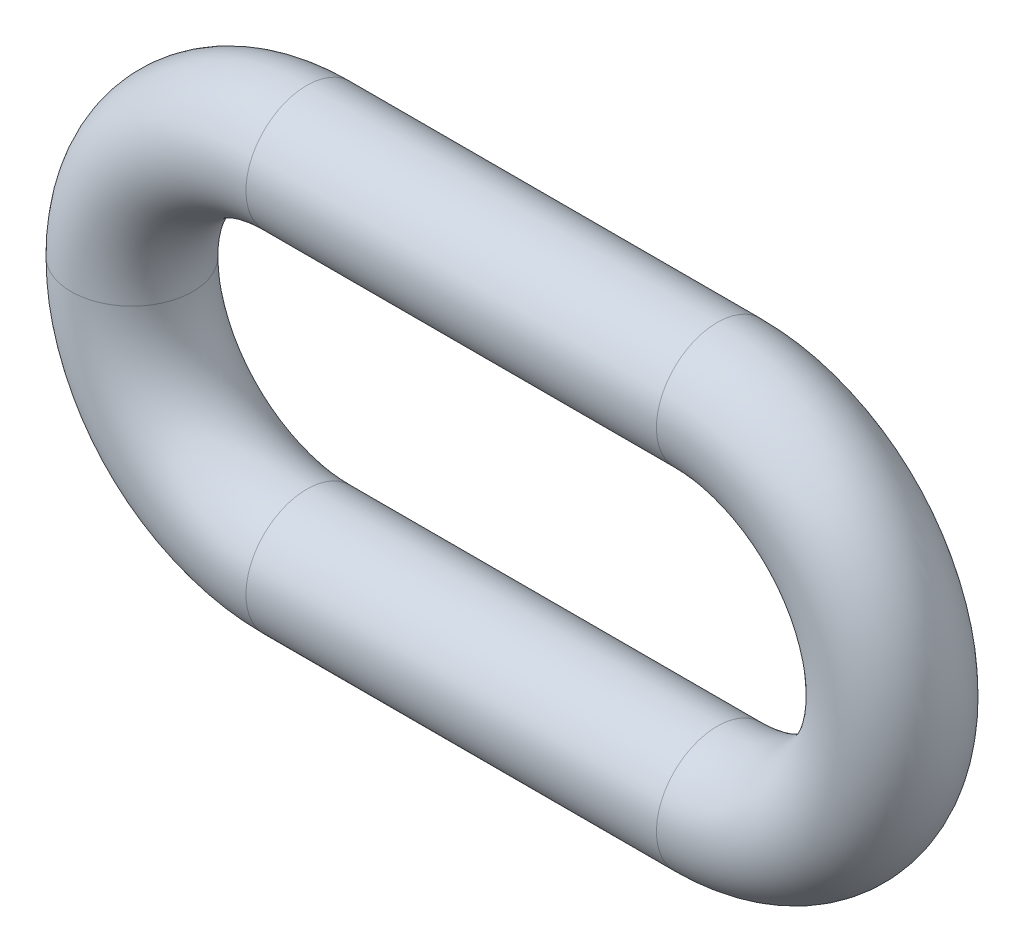
ISO-10303-21;
HEADER;
FILE_DESCRIPTION(('STEP AP214'),'2;1');
FILE_NAME('part.step','',(''),(''),'','','');
FILE_SCHEMA(('AUTOMOTIVE_DESIGN { 1 0 10303 214 1 1 1 1 }'));
ENDSEC;
DATA;
#1=APPLICATION_CONTEXT('core data for automotive mechanical design processes');
#2=APPLICATION_PROTOCOL_DEFINITION('international standard','automotive_design',2000,#1);
#3=PRODUCT_CONTEXT('',#1,'mechanical');
#4=PRODUCT('Part','Part','',(#3));
#5=PRODUCT_RELATED_PRODUCT_CATEGORY('part','',(#4));
#6=PRODUCT_DEFINITION_FORMATION('','',#4);
#7=PRODUCT_DEFINITION_CONTEXT('part definition',#1,'design');
#8=PRODUCT_DEFINITION('design','',#6,#7);
#9=PRODUCT_DEFINITION_SHAPE('','',#8);
#10=(LENGTH_UNIT() NAMED_UNIT(*) SI_UNIT(.MILLI.,.METRE.));
#11=(NAMED_UNIT(*) PLANE_ANGLE_UNIT() SI_UNIT($,.RADIAN.));
#12=(NAMED_UNIT(*) SI_UNIT($,.STERADIAN.) SOLID_ANGLE_UNIT());
#13=UNCERTAINTY_MEASURE_WITH_UNIT(LENGTH_MEASURE(1.E-05),#10,'distance_accuracy_value','');
#14=(GEOMETRIC_REPRESENTATION_CONTEXT(3) GLOBAL_UNCERTAINTY_ASSIGNED_CONTEXT((#13)) GLOBAL_UNIT_ASSIGNED_CONTEXT((#10,
#11,#12)) REPRESENTATION_CONTEXT('',''));
#15=CARTESIAN_POINT('',(0.,0.,0.));
#16=DIRECTION('',(0.,0.,1.));
#17=DIRECTION('',(1.,0.,0.));
#18=AXIS2_PLACEMENT_3D('',#15,#16,#17);
#19=CARTESIAN_POINT('',(5.75,0.,0.));
#20=DIRECTION('',(0.,0.,-1.));
#21=DIRECTION('',(-1.,0.,0.));
#22=AXIS2_PLACEMENT_3D('',#19,#20,#21);
#23=TOROIDAL_SURFACE('',#22,5.75,2.);
#24=CARTESIAN_POINT('',(5.75,-5.75,0.));
#25=DIRECTION('',(-1.,0.,0.));
#26=DIRECTION('',(0.,0.,1.));
#27=AXIS2_PLACEMENT_3D('',#24,#25,#26);
#28=CIRCLE('',#27,2.);
#29=CARTESIAN_POINT('',(5.75,-7.75,0.));
#30=VERTEX_POINT('',#29);
#31=EDGE_CURVE('E10',#30,#30,#28,.T.);
#32=CARTESIAN_POINT('',(0.,0.,0.));
#33=DIRECTION('',(0.,1.,0.));
#34=DIRECTION('',(0.,0.,1.));
#35=AXIS2_PLACEMENT_3D('',#32,#33,#34);
#36=CIRCLE('',#35,2.);
#37=CARTESIAN_POINT('',(-2.,0.,0.));
#38=VERTEX_POINT('',#37);
#39=EDGE_CURVE('E67',#38,#38,#36,.T.);
#40=CARTESIAN_POINT('',(5.75,0.,0.));
#41=DIRECTION('',(0.,0.,-1.));
#42=DIRECTION('',(-1.,0.,0.));
#43=AXIS2_PLACEMENT_3D('',#40,#41,#42);
#44=CIRCLE('',#43,7.75);
#45=EDGE_CURVE('',#30,#38,#44,.T.);
#46=ORIENTED_EDGE('',*,*,#31,.T.);
#47=ORIENTED_EDGE('',*,*,#39,.F.);
#48=ORIENTED_EDGE('',*,*,#45,.T.);
#49=ORIENTED_EDGE('',*,*,#45,.F.);
#50=EDGE_LOOP('',(#46,#48,#47,#49));
#51=FACE_BOUND('',#50,.T.);
#52=ADVANCED_FACE('F42',(#51),#23,.T.);
#53=CARTESIAN_POINT('',(19.25,-5.75,0.));
#54=DIRECTION('',(-1.,0.,0.));
#55=DIRECTION('',(0.,-1.,0.));
#56=AXIS2_PLACEMENT_3D('',#53,#54,#55);
#57=CYLINDRICAL_SURFACE('',#56,2.);
#58=ORIENTED_EDGE('',*,*,#31,.F.);
#59=EDGE_LOOP('',(#58));
#60=FACE_BOUND('',#59,.T.);
#61=CARTESIAN_POINT('',(19.25,-5.75,0.));
#62=DIRECTION('',(-1.,0.,0.));
#63=DIRECTION('',(0.,0.,1.));
#64=AXIS2_PLACEMENT_3D('',#61,#62,#63);
#65=CIRCLE('',#64,2.);
#66=CARTESIAN_POINT('',(19.25,-7.75,0.));
#67=VERTEX_POINT('',#66);
#68=EDGE_CURVE('E49',#67,#67,#65,.T.);
#69=ORIENTED_EDGE('',*,*,#68,.T.);
#70=EDGE_LOOP('',(#69));
#71=FACE_BOUND('',#70,.T.);
#72=ADVANCED_FACE('F76',(#60,#71),#57,.T.);
#73=CARTESIAN_POINT('',(19.25,0.,0.));
#74=DIRECTION('',(0.,0.,-1.));
#75=DIRECTION('',(-1.,0.,0.));
#76=AXIS2_PLACEMENT_3D('',#73,#74,#75);
#77=TOROIDAL_SURFACE('',#76,5.75,2.);
#78=CARTESIAN_POINT('',(19.25,5.75,0.));
#79=DIRECTION('',(1.,0.,0.));
#80=DIRECTION('',(0.,0.,1.));
#81=AXIS2_PLACEMENT_3D('',#78,#79,#80);
#82=CIRCLE('',#81,2.);
#83=CARTESIAN_POINT('',(19.25,7.75,0.));
#84=VERTEX_POINT('',#83);
#85=EDGE_CURVE('E55',#84,#84,#82,.T.);
#86=CARTESIAN_POINT('',(19.25,0.,0.));
#87=DIRECTION('',(0.,0.,-1.));
#88=DIRECTION('',(-1.,0.,0.));
#89=AXIS2_PLACEMENT_3D('',#86,#87,#88);
#90=CIRCLE('',#89,7.75);
#91=EDGE_CURVE('',#84,#67,#90,.T.);
#92=ORIENTED_EDGE('',*,*,#85,.T.);
#93=ORIENTED_EDGE('',*,*,#68,.F.);
#94=ORIENTED_EDGE('',*,*,#91,.T.);
#95=ORIENTED_EDGE('',*,*,#91,.F.);
#96=EDGE_LOOP('',(#92,#94,#93,#95));
#97=FACE_BOUND('',#96,.T.);
#98=ADVANCED_FACE('F80',(#97),#77,.T.);
#99=CARTESIAN_POINT('',(5.75,5.75,0.));
#100=DIRECTION('',(1.,0.,0.));
#101=DIRECTION('',(0.,1.,0.));
#102=AXIS2_PLACEMENT_3D('',#99,#100,#101);
#103=CYLINDRICAL_SURFACE('',#102,2.);
#104=ORIENTED_EDGE('',*,*,#85,.F.);
#105=EDGE_LOOP('',(#104));
#106=FACE_BOUND('',#105,.T.);
#107=CARTESIAN_POINT('',(5.75,5.75,0.));
#108=DIRECTION('',(1.,0.,0.));
#109=DIRECTION('',(0.,0.,1.));
#110=AXIS2_PLACEMENT_3D('',#107,#108,#109);
#111=CIRCLE('',#110,2.);
#112=CARTESIAN_POINT('',(5.75,7.75,0.));
#113=VERTEX_POINT('',#112);
#114=EDGE_CURVE('E61',#113,#113,#111,.T.);
#115=ORIENTED_EDGE('',*,*,#114,.T.);
#116=EDGE_LOOP('',(#115));
#117=FACE_BOUND('',#116,.T.);
#118=ADVANCED_FACE('F85',(#106,#117),#103,.T.);
#119=CARTESIAN_POINT('',(5.75,0.,0.));
#120=DIRECTION('',(0.,0.,-1.));
#121=DIRECTION('',(-1.,0.,0.));
#122=AXIS2_PLACEMENT_3D('',#119,#120,#121);
#123=TOROIDAL_SURFACE('',#122,5.75,2.);
#124=CARTESIAN_POINT('',(5.75,0.,0.));
#125=DIRECTION('',(0.,0.,-1.));
#126=DIRECTION('',(-1.,0.,0.));
#127=AXIS2_PLACEMENT_3D('',#124,#125,#126);
#128=CIRCLE('',#127,7.75);
#129=EDGE_CURVE('',#38,#113,#128,.T.);
#130=ORIENTED_EDGE('',*,*,#39,.T.);
#131=ORIENTED_EDGE('',*,*,#114,.F.);
#132=ORIENTED_EDGE('',*,*,#129,.T.);
#133=ORIENTED_EDGE('',*,*,#129,.F.);
#134=EDGE_LOOP('',(#130,#132,#131,#133));
#135=FACE_BOUND('',#134,.T.);
#136=ADVANCED_FACE('F73',(#135),#123,.T.);
#137=CLOSED_SHELL('',(#52,#72,#98,#118,#136));
#138=MANIFOLD_SOLID_BREP('B2',#137);
#139=ADVANCED_BREP_SHAPE_REPRESENTATION('',(#18,#138),#14);
#140=SHAPE_DEFINITION_REPRESENTATION(#9,#139);
ENDSEC;
END-ISO-10303-21;
